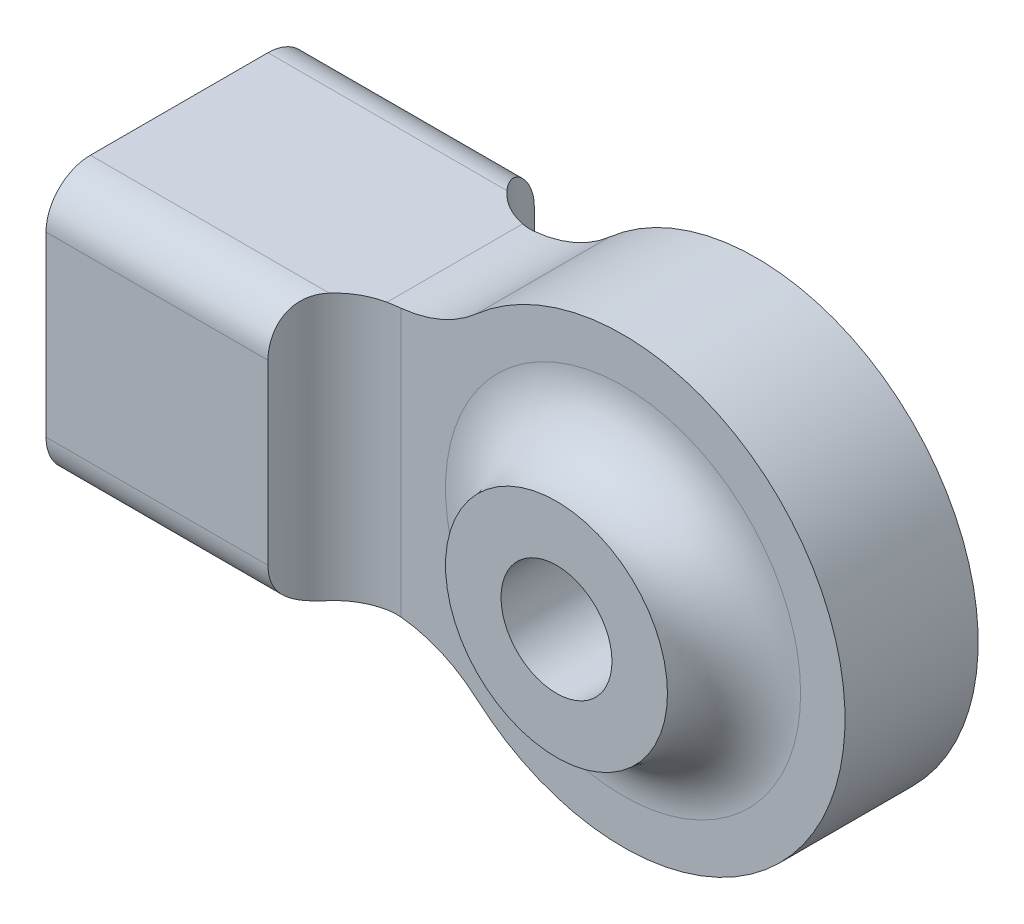
ISO-10303-21;
HEADER;
FILE_DESCRIPTION(('STEP AP214'),'2;1');
FILE_NAME('part.step','',(''),(''),'','','');
FILE_SCHEMA(('AUTOMOTIVE_DESIGN { 1 0 10303 214 1 1 1 1 }'));
ENDSEC;
DATA;
#1=APPLICATION_CONTEXT('core data for automotive mechanical design processes');
#2=APPLICATION_PROTOCOL_DEFINITION('international standard','automotive_design',2000,#1);
#3=PRODUCT_CONTEXT('',#1,'mechanical');
#4=PRODUCT('Part','Part','',(#3));
#5=PRODUCT_RELATED_PRODUCT_CATEGORY('part','',(#4));
#6=PRODUCT_DEFINITION_FORMATION('','',#4);
#7=PRODUCT_DEFINITION_CONTEXT('part definition',#1,'design');
#8=PRODUCT_DEFINITION('design','',#6,#7);
#9=PRODUCT_DEFINITION_SHAPE('','',#8);
#10=(LENGTH_UNIT() NAMED_UNIT(*) SI_UNIT(.MILLI.,.METRE.));
#11=(NAMED_UNIT(*) PLANE_ANGLE_UNIT() SI_UNIT($,.RADIAN.));
#12=(NAMED_UNIT(*) SI_UNIT($,.STERADIAN.) SOLID_ANGLE_UNIT());
#13=UNCERTAINTY_MEASURE_WITH_UNIT(LENGTH_MEASURE(1.E-05),#10,'distance_accuracy_value','');
#14=(GEOMETRIC_REPRESENTATION_CONTEXT(3) GLOBAL_UNCERTAINTY_ASSIGNED_CONTEXT((#13)) GLOBAL_UNIT_ASSIGNED_CONTEXT((#10,
#11,#12)) REPRESENTATION_CONTEXT('',''));
#15=CARTESIAN_POINT('',(0.,0.,0.));
#16=DIRECTION('',(0.,0.,1.));
#17=DIRECTION('',(1.,0.,0.));
#18=AXIS2_PLACEMENT_3D('',#15,#16,#17);
#19=CARTESIAN_POINT('',(0.,0.,0.));
#20=DIRECTION('',(0.,0.,1.));
#21=DIRECTION('',(1.,0.,0.));
#22=AXIS2_PLACEMENT_3D('',#19,#20,#21);
#23=PLANE('',#22);
#24=CARTESIAN_POINT('',(0.,0.,0.));
#25=DIRECTION('',(0.,0.,1.));
#26=DIRECTION('',(1.,0.,0.));
#27=AXIS2_PLACEMENT_3D('',#24,#25,#26);
#28=CIRCLE('',#27,8.);
#29=CARTESIAN_POINT('',(8.,0.,0.));
#30=VERTEX_POINT('',#29);
#31=EDGE_CURVE('E43',#30,#30,#28,.T.);
#32=ORIENTED_EDGE('',*,*,#31,.T.);
#33=EDGE_LOOP('',(#32));
#34=FACE_BOUND('',#33,.T.);
#35=CARTESIAN_POINT('',(0.,0.,0.));
#36=DIRECTION('',(0.,0.,1.));
#37=DIRECTION('',(1.,0.,0.));
#38=AXIS2_PLACEMENT_3D('',#35,#36,#37);
#39=CIRCLE('',#38,10.);
#40=CARTESIAN_POINT('',(-6.61437827766148,-7.5,0.));
#41=VERTEX_POINT('',#40);
#42=CARTESIAN_POINT('',(-6.61437827766148,7.5,0.));
#43=VERTEX_POINT('',#42);
#44=EDGE_CURVE('E503',#41,#43,#39,.T.);
#45=ORIENTED_EDGE('',*,*,#44,.F.);
#46=CARTESIAN_POINT('',(-10.5830052442584,-12.,0.));
#47=DIRECTION('',(0.,0.,1.));
#48=DIRECTION('',(1.,0.,0.));
#49=AXIS2_PLACEMENT_3D('',#46,#47,#48);
#50=CIRCLE('',#49,6.);
#51=CARTESIAN_POINT('',(-10.,-6.02839176727347,0.));
#52=VERTEX_POINT('',#51);
#53=EDGE_CURVE('E197',#41,#52,#50,.T.);
#54=ORIENTED_EDGE('',*,*,#53,.T.);
#55=DIRECTION('',(0.,-1.,0.));
#56=VECTOR('',#55,1.);
#57=CARTESIAN_POINT('',(-10.,6.,0.));
#58=LINE('',#57,#56);
#59=CARTESIAN_POINT('',(-10.,6.02839176727347,0.));
#60=VERTEX_POINT('',#59);
#61=EDGE_CURVE('E518',#52,#60,#58,.F.);
#62=ORIENTED_EDGE('',*,*,#61,.T.);
#63=CARTESIAN_POINT('',(-10.5830052442584,12.,0.));
#64=DIRECTION('',(0.,0.,1.));
#65=DIRECTION('',(1.,0.,0.));
#66=AXIS2_PLACEMENT_3D('',#63,#64,#65);
#67=CIRCLE('',#66,6.);
#68=EDGE_CURVE('E146',#60,#43,#67,.T.);
#69=ORIENTED_EDGE('',*,*,#68,.T.);
#70=EDGE_LOOP('',(#45,#54,#62,#69));
#71=FACE_BOUND('',#70,.T.);
#72=ADVANCED_FACE('F35',(#34,#71),#23,.F.);
#73=CARTESIAN_POINT('',(0.,0.,6.));
#74=DIRECTION('',(0.,0.,-1.));
#75=DIRECTION('',(-1.,0.,0.));
#76=AXIS2_PLACEMENT_3D('',#73,#74,#75);
#77=CYLINDRICAL_SURFACE('',#76,10.);
#78=ORIENTED_EDGE('',*,*,#44,.T.);
#79=DIRECTION('',(0.,0.,-1.));
#80=VECTOR('',#79,1.);
#81=CARTESIAN_POINT('',(-6.61437827766148,7.5,6.));
#82=LINE('',#81,#80);
#83=CARTESIAN_POINT('',(-6.61437827766148,7.5,6.));
#84=VERTEX_POINT('',#83);
#85=EDGE_CURVE('E173',#43,#84,#82,.F.);
#86=ORIENTED_EDGE('',*,*,#85,.T.);
#87=CARTESIAN_POINT('',(0.,0.,6.));
#88=DIRECTION('',(0.,0.,1.));
#89=DIRECTION('',(1.,0.,0.));
#90=AXIS2_PLACEMENT_3D('',#87,#88,#89);
#91=CIRCLE('',#90,10.);
#92=CARTESIAN_POINT('',(-6.61437827766148,-7.5,6.));
#93=VERTEX_POINT('',#92);
#94=EDGE_CURVE('E506',#93,#84,#91,.T.);
#95=ORIENTED_EDGE('',*,*,#94,.F.);
#96=DIRECTION('',(0.,0.,-1.));
#97=VECTOR('',#96,1.);
#98=CARTESIAN_POINT('',(-6.61437827766148,-7.5,6.));
#99=LINE('',#98,#97);
#100=EDGE_CURVE('E160',#93,#41,#99,.T.);
#101=ORIENTED_EDGE('',*,*,#100,.T.);
#102=EDGE_LOOP('',(#78,#86,#95,#101));
#103=FACE_BOUND('',#102,.T.);
#104=ADVANCED_FACE('F206',(#103),#77,.T.);
#105=CARTESIAN_POINT('',(0.,6.,6.));
#106=DIRECTION('',(0.,-1.,0.));
#107=DIRECTION('',(1.,0.,0.));
#108=AXIS2_PLACEMENT_3D('',#105,#106,#107);
#109=PLANE('',#108);
#110=DIRECTION('',(0.,0.,-1.));
#111=VECTOR('',#110,1.);
#112=CARTESIAN_POINT('',(-23.,6.,6.));
#113=LINE('',#112,#111);
#114=CARTESIAN_POINT('',(-23.,6.,7.00000000000001));
#115=VERTEX_POINT('',#114);
#116=CARTESIAN_POINT('',(-23.,6.,-0.999999999999999));
#117=VERTEX_POINT('',#116);
#118=EDGE_CURVE('E513',#115,#117,#113,.T.);
#119=ORIENTED_EDGE('',*,*,#118,.F.);
#120=DIRECTION('',(-1.,0.,0.));
#121=VECTOR('',#120,1.);
#122=CARTESIAN_POINT('',(0.,6.,7.00000000000001));
#123=LINE('',#122,#121);
#124=CARTESIAN_POINT('',(-12.2360679774998,6.,7.00000000000001));
#125=VERTEX_POINT('',#124);
#126=EDGE_CURVE('E226',#115,#125,#123,.F.);
#127=ORIENTED_EDGE('',*,*,#126,.T.);
#128=CARTESIAN_POINT('',(-10.,6.,9.));
#129=DIRECTION('',(0.,-1.,0.));
#130=DIRECTION('',(1.,0.,0.));
#131=AXIS2_PLACEMENT_3D('',#128,#129,#130);
#132=CIRCLE('',#131,3.);
#133=CARTESIAN_POINT('',(-10.5830052442584,6.,6.05719438542617));
#134=VERTEX_POINT('',#133);
#135=EDGE_CURVE('E158',#125,#134,#132,.T.);
#136=ORIENTED_EDGE('',*,*,#135,.T.);
#137=DIRECTION('',(0.,0.,1.));
#138=VECTOR('',#137,1.);
#139=CARTESIAN_POINT('',(-10.5830052442584,6.,0.));
#140=LINE('',#139,#138);
#141=CARTESIAN_POINT('',(-10.5830052442584,6.,-0.0571943854261723));
#142=VERTEX_POINT('',#141);
#143=EDGE_CURVE('E144',#134,#142,#140,.F.);
#144=ORIENTED_EDGE('',*,*,#143,.T.);
#145=CARTESIAN_POINT('',(-10.,6.,-3.));
#146=DIRECTION('',(0.,-1.,0.));
#147=DIRECTION('',(1.,0.,0.));
#148=AXIS2_PLACEMENT_3D('',#145,#146,#147);
#149=CIRCLE('',#148,3.);
#150=CARTESIAN_POINT('',(-12.2360679774998,6.,-1.));
#151=VERTEX_POINT('',#150);
#152=EDGE_CURVE('E155',#142,#151,#149,.T.);
#153=ORIENTED_EDGE('',*,*,#152,.T.);
#154=DIRECTION('',(-1.,0.,0.));
#155=VECTOR('',#154,1.);
#156=CARTESIAN_POINT('',(-23.,6.,-0.999999999999999));
#157=LINE('',#156,#155);
#158=EDGE_CURVE('E568',#151,#117,#157,.T.);
#159=ORIENTED_EDGE('',*,*,#158,.T.);
#160=EDGE_LOOP('',(#119,#127,#136,#144,#153,#159));
#161=FACE_BOUND('',#160,.T.);
#162=ADVANCED_FACE('F153',(#161),#109,.F.);
#163=CARTESIAN_POINT('',(-23.,0.,6.));
#164=DIRECTION('',(-1.,0.,0.));
#165=DIRECTION('',(0.,0.,1.));
#166=AXIS2_PLACEMENT_3D('',#163,#164,#165);
#167=PLANE('',#166);
#168=CARTESIAN_POINT('',(-23.,0.,3.));
#169=DIRECTION('',(-1.,0.,0.));
#170=DIRECTION('',(0.,0.,1.));
#171=AXIS2_PLACEMENT_3D('',#168,#169,#170);
#172=CIRCLE('',#171,2.5);
#173=CARTESIAN_POINT('',(-23.,0.,5.5));
#174=VERTEX_POINT('',#173);
#175=EDGE_CURVE('E483',#174,#174,#172,.T.);
#176=ORIENTED_EDGE('',*,*,#175,.F.);
#177=EDGE_LOOP('',(#176));
#178=FACE_BOUND('',#177,.T.);
#179=DIRECTION('',(0.,-1.,0.));
#180=VECTOR('',#179,1.);
#181=CARTESIAN_POINT('',(-23.,0.,9.00000000000001));
#182=LINE('',#181,#180);
#183=CARTESIAN_POINT('',(-23.,4.,9.00000000000001));
#184=VERTEX_POINT('',#183);
#185=CARTESIAN_POINT('',(-23.,-4.,9.00000000000001));
#186=VERTEX_POINT('',#185);
#187=EDGE_CURVE('E497',#184,#186,#182,.T.);
#188=ORIENTED_EDGE('',*,*,#187,.F.);
#189=CARTESIAN_POINT('',(-23.,4.,7.00000000000001));
#190=DIRECTION('',(-1.,0.,0.));
#191=DIRECTION('',(0.,0.,1.));
#192=AXIS2_PLACEMENT_3D('',#189,#190,#191);
#193=CIRCLE('',#192,2.);
#194=EDGE_CURVE('E558',#184,#115,#193,.T.);
#195=ORIENTED_EDGE('',*,*,#194,.T.);
#196=ORIENTED_EDGE('',*,*,#118,.T.);
#197=CARTESIAN_POINT('',(-23.,4.,-0.999999999999999));
#198=DIRECTION('',(-1.,0.,0.));
#199=DIRECTION('',(0.,0.,1.));
#200=AXIS2_PLACEMENT_3D('',#197,#198,#199);
#201=CIRCLE('',#200,2.);
#202=CARTESIAN_POINT('',(-23.,4.,-3.));
#203=VERTEX_POINT('',#202);
#204=EDGE_CURVE('E566',#117,#203,#201,.T.);
#205=ORIENTED_EDGE('',*,*,#204,.T.);
#206=DIRECTION('',(0.,-1.,0.));
#207=VECTOR('',#206,1.);
#208=CARTESIAN_POINT('',(-23.,0.,-3.));
#209=LINE('',#208,#207);
#210=CARTESIAN_POINT('',(-23.,-4.,-3.));
#211=VERTEX_POINT('',#210);
#212=EDGE_CURVE('E492',#203,#211,#209,.T.);
#213=ORIENTED_EDGE('',*,*,#212,.T.);
#214=CARTESIAN_POINT('',(-23.,-4.,-0.999999999999998));
#215=DIRECTION('',(-1.,0.,0.));
#216=DIRECTION('',(0.,0.,1.));
#217=AXIS2_PLACEMENT_3D('',#214,#215,#216);
#218=CIRCLE('',#217,2.);
#219=CARTESIAN_POINT('',(-23.,-6.,-0.999999999999997));
#220=VERTEX_POINT('',#219);
#221=EDGE_CURVE('E560',#211,#220,#218,.T.);
#222=ORIENTED_EDGE('',*,*,#221,.T.);
#223=DIRECTION('',(0.,0.,-1.));
#224=VECTOR('',#223,1.);
#225=CARTESIAN_POINT('',(-23.,-6.,6.));
#226=LINE('',#225,#224);
#227=CARTESIAN_POINT('',(-23.,-6.,7.));
#228=VERTEX_POINT('',#227);
#229=EDGE_CURVE('E509',#228,#220,#226,.T.);
#230=ORIENTED_EDGE('',*,*,#229,.F.);
#231=CARTESIAN_POINT('',(-23.,-4.,7.));
#232=DIRECTION('',(-1.,0.,0.));
#233=DIRECTION('',(0.,0.,1.));
#234=AXIS2_PLACEMENT_3D('',#231,#232,#233);
#235=CIRCLE('',#234,2.);
#236=EDGE_CURVE('E531',#228,#186,#235,.T.);
#237=ORIENTED_EDGE('',*,*,#236,.T.);
#238=EDGE_LOOP('',(#188,#195,#196,#205,#213,#222,#230,#237));
#239=FACE_BOUND('',#238,.T.);
#240=ADVANCED_FACE('F271',(#178,#239),#167,.T.);
#241=CARTESIAN_POINT('',(0.,-6.,6.));
#242=DIRECTION('',(0.,-1.,0.));
#243=DIRECTION('',(0.,0.,-1.));
#244=AXIS2_PLACEMENT_3D('',#241,#242,#243);
#245=PLANE('',#244);
#246=ORIENTED_EDGE('',*,*,#229,.T.);
#247=DIRECTION('',(-1.,0.,0.));
#248=VECTOR('',#247,1.);
#249=CARTESIAN_POINT('',(0.,-6.,-0.999999999999997));
#250=LINE('',#249,#248);
#251=CARTESIAN_POINT('',(-12.2360679774998,-6.,-0.999999999999997));
#252=VERTEX_POINT('',#251);
#253=EDGE_CURVE('E50',#220,#252,#250,.F.);
#254=ORIENTED_EDGE('',*,*,#253,.T.);
#255=CARTESIAN_POINT('',(-10.,-6.,-3.));
#256=DIRECTION('',(0.,-1.,0.));
#257=DIRECTION('',(0.,0.,-1.));
#258=AXIS2_PLACEMENT_3D('',#255,#256,#257);
#259=CIRCLE('',#258,3.);
#260=CARTESIAN_POINT('',(-10.5830052442584,-6.,-0.057194385426171));
#261=VERTEX_POINT('',#260);
#262=EDGE_CURVE('E165',#252,#261,#259,.F.);
#263=ORIENTED_EDGE('',*,*,#262,.T.);
#264=DIRECTION('',(0.,0.,-1.));
#265=VECTOR('',#264,1.);
#266=CARTESIAN_POINT('',(-10.5830052442584,-6.,6.));
#267=LINE('',#266,#265);
#268=CARTESIAN_POINT('',(-10.5830052442584,-6.,6.05719438542617));
#269=VERTEX_POINT('',#268);
#270=EDGE_CURVE('E148',#261,#269,#267,.F.);
#271=ORIENTED_EDGE('',*,*,#270,.T.);
#272=CARTESIAN_POINT('',(-10.,-6.,9.));
#273=DIRECTION('',(0.,-1.,0.));
#274=DIRECTION('',(0.,0.,-1.));
#275=AXIS2_PLACEMENT_3D('',#272,#273,#274);
#276=CIRCLE('',#275,3.);
#277=CARTESIAN_POINT('',(-12.2360679774998,-6.,7.));
#278=VERTEX_POINT('',#277);
#279=EDGE_CURVE('E167',#269,#278,#276,.F.);
#280=ORIENTED_EDGE('',*,*,#279,.T.);
#281=DIRECTION('',(-1.,0.,0.));
#282=VECTOR('',#281,1.);
#283=CARTESIAN_POINT('',(-23.,-6.,7.));
#284=LINE('',#283,#282);
#285=EDGE_CURVE('E524',#278,#228,#284,.T.);
#286=ORIENTED_EDGE('',*,*,#285,.T.);
#287=EDGE_LOOP('',(#246,#254,#263,#271,#280,#286));
#288=FACE_BOUND('',#287,.T.);
#289=ADVANCED_FACE('F268',(#288),#245,.T.);
#290=CARTESIAN_POINT('',(0.,0.,6.));
#291=DIRECTION('',(0.,0.,1.));
#292=DIRECTION('',(1.,0.,0.));
#293=AXIS2_PLACEMENT_3D('',#290,#291,#292);
#294=PLANE('',#293);
#295=CARTESIAN_POINT('',(0.,0.,6.));
#296=DIRECTION('',(0.,0.,1.));
#297=DIRECTION('',(1.,0.,0.));
#298=AXIS2_PLACEMENT_3D('',#295,#296,#297);
#299=CIRCLE('',#298,8.);
#300=CARTESIAN_POINT('',(8.,0.,6.));
#301=VERTEX_POINT('',#300);
#302=EDGE_CURVE('E11',#301,#301,#299,.F.);
#303=ORIENTED_EDGE('',*,*,#302,.T.);
#304=EDGE_LOOP('',(#303));
#305=FACE_BOUND('',#304,.T.);
#306=ORIENTED_EDGE('',*,*,#94,.T.);
#307=CARTESIAN_POINT('',(-10.5830052442584,12.,6.));
#308=DIRECTION('',(0.,0.,1.));
#309=DIRECTION('',(1.,0.,0.));
#310=AXIS2_PLACEMENT_3D('',#307,#308,#309);
#311=CIRCLE('',#310,6.);
#312=CARTESIAN_POINT('',(-10.,6.02839176727347,6.));
#313=VERTEX_POINT('',#312);
#314=EDGE_CURVE('E198',#84,#313,#311,.F.);
#315=ORIENTED_EDGE('',*,*,#314,.T.);
#316=DIRECTION('',(0.,1.,0.));
#317=VECTOR('',#316,1.);
#318=CARTESIAN_POINT('',(-10.,0.,6.));
#319=LINE('',#318,#317);
#320=CARTESIAN_POINT('',(-10.,-6.02839176727347,6.));
#321=VERTEX_POINT('',#320);
#322=EDGE_CURVE('E516',#313,#321,#319,.F.);
#323=ORIENTED_EDGE('',*,*,#322,.T.);
#324=CARTESIAN_POINT('',(-10.5830052442584,-12.,6.));
#325=DIRECTION('',(0.,0.,1.));
#326=DIRECTION('',(1.,0.,0.));
#327=AXIS2_PLACEMENT_3D('',#324,#325,#326);
#328=CIRCLE('',#327,6.);
#329=EDGE_CURVE('E562',#321,#93,#328,.F.);
#330=ORIENTED_EDGE('',*,*,#329,.T.);
#331=EDGE_LOOP('',(#306,#315,#323,#330));
#332=FACE_BOUND('',#331,.T.);
#333=ADVANCED_FACE('F266',(#305,#332),#294,.T.);
#334=CARTESIAN_POINT('',(-13.,0.,9.00000000000001));
#335=DIRECTION('',(0.,0.,-1.));
#336=DIRECTION('',(0.,1.,0.));
#337=AXIS2_PLACEMENT_3D('',#334,#335,#336);
#338=PLANE('',#337);
#339=DIRECTION('',(0.,-1.,0.));
#340=VECTOR('',#339,1.);
#341=CARTESIAN_POINT('',(-13.,0.,9.00000000000001));
#342=LINE('',#341,#340);
#343=CARTESIAN_POINT('',(-13.,4.,9.00000000000001));
#344=VERTEX_POINT('',#343);
#345=CARTESIAN_POINT('',(-13.,-4.,9.00000000000001));
#346=VERTEX_POINT('',#345);
#347=EDGE_CURVE('E500',#344,#346,#342,.T.);
#348=ORIENTED_EDGE('',*,*,#347,.F.);
#349=DIRECTION('',(-1.,0.,0.));
#350=VECTOR('',#349,1.);
#351=CARTESIAN_POINT('',(-13.,4.,9.00000000000001));
#352=LINE('',#351,#350);
#353=EDGE_CURVE('E555',#344,#184,#352,.T.);
#354=ORIENTED_EDGE('',*,*,#353,.T.);
#355=ORIENTED_EDGE('',*,*,#187,.T.);
#356=DIRECTION('',(-1.,0.,0.));
#357=VECTOR('',#356,1.);
#358=CARTESIAN_POINT('',(-13.,-4.,9.00000000000001));
#359=LINE('',#358,#357);
#360=EDGE_CURVE('E557',#186,#346,#359,.F.);
#361=ORIENTED_EDGE('',*,*,#360,.T.);
#362=EDGE_LOOP('',(#348,#354,#355,#361));
#363=FACE_BOUND('',#362,.T.);
#364=ADVANCED_FACE('F295',(#363),#338,.F.);
#365=CARTESIAN_POINT('',(-13.,0.,-3.));
#366=DIRECTION('',(0.,0.,-1.));
#367=DIRECTION('',(0.,1.,0.));
#368=AXIS2_PLACEMENT_3D('',#365,#366,#367);
#369=PLANE('',#368);
#370=ORIENTED_EDGE('',*,*,#212,.F.);
#371=DIRECTION('',(-1.,0.,0.));
#372=VECTOR('',#371,1.);
#373=CARTESIAN_POINT('',(-13.,4.,-3.));
#374=LINE('',#373,#372);
#375=CARTESIAN_POINT('',(-13.,4.,-3.));
#376=VERTEX_POINT('',#375);
#377=EDGE_CURVE('E545',#203,#376,#374,.F.);
#378=ORIENTED_EDGE('',*,*,#377,.T.);
#379=DIRECTION('',(0.,-1.,0.));
#380=VECTOR('',#379,1.);
#381=CARTESIAN_POINT('',(-13.,0.,-3.));
#382=LINE('',#381,#380);
#383=CARTESIAN_POINT('',(-13.,-4.,-3.));
#384=VERTEX_POINT('',#383);
#385=EDGE_CURVE('E495',#376,#384,#382,.T.);
#386=ORIENTED_EDGE('',*,*,#385,.T.);
#387=DIRECTION('',(-1.,0.,0.));
#388=VECTOR('',#387,1.);
#389=CARTESIAN_POINT('',(-13.,-4.,-3.));
#390=LINE('',#389,#388);
#391=EDGE_CURVE('E546',#384,#211,#390,.T.);
#392=ORIENTED_EDGE('',*,*,#391,.T.);
#393=EDGE_LOOP('',(#370,#378,#386,#392));
#394=FACE_BOUND('',#393,.T.);
#395=ADVANCED_FACE('F204',(#394),#369,.T.);
#396=CARTESIAN_POINT('',(-10.,0.,9.));
#397=DIRECTION('',(0.,1.,0.));
#398=DIRECTION('',(0.,0.,1.));
#399=AXIS2_PLACEMENT_3D('',#396,#397,#398);
#400=CYLINDRICAL_SURFACE('',#399,3.);
#401=ORIENTED_EDGE('',*,*,#135,.F.);
#402=CARTESIAN_POINT('',(-12.2360679774998,6.,7.00000000000001));
#403=CARTESIAN_POINT('',(-12.2728854963177,6.00000246436278,7.04115091780122));
#404=CARTESIAN_POINT('',(-12.3085660720211,5.99872941245928,7.08334205467759));
#405=CARTESIAN_POINT('',(-12.3774925726874,5.99326859290413,7.16954514222249));
#406=CARTESIAN_POINT('',(-12.4107363184585,5.98907825071382,7.21355866887521));
#407=CARTESIAN_POINT('',(-12.4746704788407,5.97739818389775,7.30322436177444));
#408=CARTESIAN_POINT('',(-12.5053518867135,5.96989735912992,7.34888156219626));
#409=CARTESIAN_POINT('',(-12.5638442589029,5.95128752456252,7.44125077197121));
#410=CARTESIAN_POINT('',(-12.5916560751113,5.94017958968548,7.48796246323106));
#411=CARTESIAN_POINT('',(-12.670883895736,5.90084828303763,7.62957808407147));
#412=CARTESIAN_POINT('',(-12.7177688524955,5.86666959692464,7.72550494882894));
#413=CARTESIAN_POINT('',(-12.7987755505931,5.78149511078044,7.91488962633863));
#414=CARTESIAN_POINT('',(-12.8329313455432,5.73054487740597,8.0083533960413));
#415=CARTESIAN_POINT('',(-12.8869362313674,5.61797275843954,8.17968923532625));
#416=CARTESIAN_POINT('',(-12.9078328939747,5.55781591522778,8.25819990460024));
#417=CARTESIAN_POINT('',(-12.9416683233782,5.42546942572144,8.40638422576809));
#418=CARTESIAN_POINT('',(-12.9545996137314,5.35326855519881,8.47604952670763));
#419=CARTESIAN_POINT('',(-12.974558972197,5.19804023541891,8.60466864816259));
#420=CARTESIAN_POINT('',(-12.9815304946049,5.11491753034152,8.66351579566274));
#421=CARTESIAN_POINT('',(-12.9914768287617,4.94050336835899,8.76799188089132));
#422=CARTESIAN_POINT('',(-12.9944498592886,4.84920829018026,8.81361492053613));
#423=CARTESIAN_POINT('',(-12.9983820643305,4.65405126321282,8.89317117612618));
#424=CARTESIAN_POINT('',(-12.999184112796,4.54975715834621,8.92605072649268));
#425=CARTESIAN_POINT('',(-12.9999891159124,4.33731369422501,8.9743473813685));
#426=CARTESIAN_POINT('',(-12.9999934707567,4.229171423518,8.98979503673855));
#427=CARTESIAN_POINT('',(-12.9999985880697,4.10055601943193,8.99757270719581));
#428=CARTESIAN_POINT('',(-12.9999993865401,4.08044281491849,8.99848335718228));
#429=CARTESIAN_POINT('',(-13.0000003370699,4.04022157349941,8.99969624226284));
#430=CARTESIAN_POINT('',(-13.0000004898832,4.02011355800554,8.99999918686816));
#431=CARTESIAN_POINT('',(-13.,4.,9.00000000000001));
#432=B_SPLINE_CURVE_WITH_KNOTS('',3,(#402,#403,#404,#405,#406,#407,#408,#409,#410,#411,#412,
#413,#414,#415,#416,#417,#418,#419,#420,#421,#422,#423,#424,#425,#426,#427,#428,#429,#430,#431),
.UNSPECIFIED.,.F.,.F.,(4,2,2,2,2,2,2,2,2,2,2,2,2,2,4),(0.,0.16564009897896,0.331426562654032,
0.497773186994362,0.664070285290275,0.998329719602763,1.33168839760093,1.63351885718953,
1.93563219034523,2.2405811028478,2.54566581704908,2.87230570272864,3.19837223112797,
3.25877009040263,3.31909739252996),.UNSPECIFIED.);
#433=EDGE_CURVE('E225',#125,#344,#432,.T.);
#434=ORIENTED_EDGE('',*,*,#433,.T.);
#435=ORIENTED_EDGE('',*,*,#347,.T.);
#436=CARTESIAN_POINT('',(-13.,-4.,9.00000000000001));
#437=CARTESIAN_POINT('',(-12.9999884326362,-4.05599686132418,9.000005262699));
#438=CARTESIAN_POINT('',(-12.9999997013507,-4.1119911449692,8.99764827062337));
#439=CARTESIAN_POINT('',(-12.9999837288537,-4.22358374028054,8.98825056109522));
#440=CARTESIAN_POINT('',(-12.9999564887583,-4.27918206337689,8.98120997940049));
#441=CARTESIAN_POINT('',(-12.9997792949131,-4.38961436706547,8.96248262206721));
#442=CARTESIAN_POINT('',(-12.9996292985889,-4.44444807576247,8.95079423519837));
#443=CARTESIAN_POINT('',(-12.9990404148046,-4.5529256613112,8.922866259538));
#444=CARTESIAN_POINT('',(-12.9986015309304,-4.60656955292362,8.90662672724145));
#445=CARTESIAN_POINT('',(-12.9965397925711,-4.76522710422997,8.85120301996766));
#446=CARTESIAN_POINT('',(-12.9941719425829,-4.86798328940342,8.80531089645993));
#447=CARTESIAN_POINT('',(-12.9851594624459,-5.06414644572652,8.69709894237695));
#448=CARTESIAN_POINT('',(-12.9785168322406,-5.15755776524344,8.6347868019053));
#449=CARTESIAN_POINT('',(-12.9583513085478,-5.33065671648364,8.49711250770347));
#450=CARTESIAN_POINT('',(-12.9449556045598,-5.41056284194727,8.42200800641799));
#451=CARTESIAN_POINT('',(-12.908733582955,-5.55611420750753,8.26105503961363));
#452=CARTESIAN_POINT('',(-12.885914002479,-5.62176958443007,8.17521427996012));
#453=CARTESIAN_POINT('',(-12.8308325608467,-5.73313312311182,8.0030142875193));
#454=CARTESIAN_POINT('',(-12.7993289855582,-5.77990343395688,7.91709767691641));
#455=CARTESIAN_POINT('',(-12.7257118447269,-5.85921881265892,7.74326050418015));
#456=CARTESIAN_POINT('',(-12.6835961403598,-5.89176100928625,7.65533954133192));
#457=CARTESIAN_POINT('',(-12.5900459204144,-5.94282215801971,7.48306942902296));
#458=CARTESIAN_POINT('',(-12.5388300936748,-5.96162628065119,7.39868410667865));
#459=CARTESIAN_POINT('',(-12.4274116934532,-5.98796416149656,7.23435249410234));
#460=CARTESIAN_POINT('',(-12.3672165930771,-5.99550723492245,7.15440258764249));
#461=CARTESIAN_POINT('',(-12.2812299672423,-5.99951424555895,7.05136489608614));
#462=CARTESIAN_POINT('',(-12.2588631749984,-6.00000237448964,7.02547723845672));
#463=CARTESIAN_POINT('',(-12.2360679774998,-6.,7.));
#464=B_SPLINE_CURVE_WITH_KNOTS('',3,(#436,#437,#438,#439,#440,#441,#442,#443,#444,#445,#446,
#447,#448,#449,#450,#451,#452,#453,#454,#455,#456,#457,#458,#459,#460,#461,#462,#463),
.UNSPECIFIED.,.F.,.F.,(4,2,2,2,2,2,2,2,2,2,2,2,2,4),(0.,0.167936324313904,0.33586778106424,
0.503857504557729,0.671845142827373,1.00777038849101,1.34353858664391,1.67320672252813,
2.00263958513158,2.30939066341829,2.61620361545126,2.9164513504635,3.21645058074121,
3.31905049107515),.UNSPECIFIED.);
#465=EDGE_CURVE('E219',#346,#278,#464,.T.);
#466=ORIENTED_EDGE('',*,*,#465,.T.);
#467=ORIENTED_EDGE('',*,*,#279,.F.);
#468=CARTESIAN_POINT('',(-10.5830052442584,-6.,6.05719438542617));
#469=CARTESIAN_POINT('',(-10.5348963821223,-5.99999802537367,6.04766148317081));
#470=CARTESIAN_POINT('',(-10.4865527600391,-6.00057861731963,6.03931202697637));
#471=CARTESIAN_POINT('',(-10.3896868700852,-6.00292052178394,6.02501579972002));
#472=CARTESIAN_POINT('',(-10.3411655598158,-6.00467832094366,6.01906196335792));
#473=CARTESIAN_POINT('',(-10.2439475353533,-6.00938999985835,6.00953596795991));
#474=CARTESIAN_POINT('',(-10.1952508211571,-6.01234387963343,6.00596380896406));
#475=CARTESIAN_POINT('',(-10.0976830864442,-6.01945920765658,6.00119131034514));
#476=CARTESIAN_POINT('',(-10.0488119789526,-6.02362422834649,5.99999807070617));
#477=CARTESIAN_POINT('',(-10.,-6.02839176727347,6.));
#478=B_SPLINE_CURVE_WITH_KNOTS('',3,(#468,#469,#470,#471,#472,#473,#474,#475,#476,#477),
.UNSPECIFIED.,.F.,.F.,(4,2,2,2,4),(0.,0.1471149142572,0.293792711217423,0.440470510645301,
0.587585424636055),.UNSPECIFIED.);
#479=EDGE_CURVE('E213',#269,#321,#478,.T.);
#480=ORIENTED_EDGE('',*,*,#479,.T.);
#481=ORIENTED_EDGE('',*,*,#322,.F.);
#482=CARTESIAN_POINT('',(-10.,6.02839176727347,6.));
#483=CARTESIAN_POINT('',(-10.0488119789526,6.02362422834649,5.99999807070617));
#484=CARTESIAN_POINT('',(-10.0976830864443,6.01945920765658,6.00119131034514));
#485=CARTESIAN_POINT('',(-10.1952508211571,6.01234387963343,6.00596380896406));
#486=CARTESIAN_POINT('',(-10.2439475353533,6.00938999985835,6.00953596795991));
#487=CARTESIAN_POINT('',(-10.3411655598158,6.00467832094366,6.01906196335792));
#488=CARTESIAN_POINT('',(-10.3896868700852,6.00292052178394,6.02501579972002));
#489=CARTESIAN_POINT('',(-10.4865527600391,6.00057861731963,6.03931202697637));
#490=CARTESIAN_POINT('',(-10.5348963821223,5.99999802537367,6.04766148317081));
#491=CARTESIAN_POINT('',(-10.5830052442584,6.,6.05719438542617));
#492=B_SPLINE_CURVE_WITH_KNOTS('',3,(#482,#483,#484,#485,#486,#487,#488,#489,#490,#491),
.UNSPECIFIED.,.F.,.F.,(4,2,2,2,4),(0.,0.147114913990756,0.293792713418633,0.440470510378855,
0.587585424636057),.UNSPECIFIED.);
#493=EDGE_CURVE('E192',#313,#134,#492,.T.);
#494=ORIENTED_EDGE('',*,*,#493,.T.);
#495=EDGE_LOOP('',(#401,#434,#435,#466,#467,#480,#481,#494));
#496=FACE_BOUND('',#495,.T.);
#497=ADVANCED_FACE('F200',(#496),#400,.F.);
#498=CARTESIAN_POINT('',(-10.,0.,-3.));
#499=DIRECTION('',(0.,1.,0.));
#500=DIRECTION('',(0.,0.,1.));
#501=AXIS2_PLACEMENT_3D('',#498,#499,#500);
#502=CYLINDRICAL_SURFACE('',#501,3.);
#503=ORIENTED_EDGE('',*,*,#385,.F.);
#504=CARTESIAN_POINT('',(-13.,4.,-3.));
#505=CARTESIAN_POINT('',(-12.9999884326362,4.05599686132418,-3.00000526269899));
#506=CARTESIAN_POINT('',(-12.9999997013507,4.1119911449692,-2.99764827062337));
#507=CARTESIAN_POINT('',(-12.9999837288537,4.22358374028054,-2.98825056109522));
#508=CARTESIAN_POINT('',(-12.9999564887583,4.27918206337689,-2.98120997940048));
#509=CARTESIAN_POINT('',(-12.9997792949131,4.38961436706547,-2.96248262206721));
#510=CARTESIAN_POINT('',(-12.9996292985889,4.44444807576247,-2.95079423519837));
#511=CARTESIAN_POINT('',(-12.9990404148046,4.5529256613112,-2.92286625953799));
#512=CARTESIAN_POINT('',(-12.9986015309304,4.60656955292362,-2.90662672724145));
#513=CARTESIAN_POINT('',(-12.9965397925711,4.76522710422997,-2.85120301996766));
#514=CARTESIAN_POINT('',(-12.9941719425829,4.86798328940341,-2.80531089645993));
#515=CARTESIAN_POINT('',(-12.9851594624459,5.06414644572651,-2.69709894237695));
#516=CARTESIAN_POINT('',(-12.9785168322406,5.15755776524344,-2.6347868019053));
#517=CARTESIAN_POINT('',(-12.9583513085478,5.33065671648364,-2.49711250770347));
#518=CARTESIAN_POINT('',(-12.9449556045598,5.41056284194727,-2.42200800641799));
#519=CARTESIAN_POINT('',(-12.908733582955,5.55611420750752,-2.26105503961363));
#520=CARTESIAN_POINT('',(-12.885914002479,5.62176958443007,-2.17521427996012));
#521=CARTESIAN_POINT('',(-12.8308325608467,5.73313312311181,-2.0030142875193));
#522=CARTESIAN_POINT('',(-12.7993289855582,5.77990343395688,-1.91709767691641));
#523=CARTESIAN_POINT('',(-12.7257118447269,5.85921881265891,-1.74326050418015));
#524=CARTESIAN_POINT('',(-12.6835961403598,5.89176100928625,-1.65533954133192));
#525=CARTESIAN_POINT('',(-12.5900459204144,5.94282215801971,-1.48306942902296));
#526=CARTESIAN_POINT('',(-12.5388300936748,5.96162628065119,-1.39868410667865));
#527=CARTESIAN_POINT('',(-12.4274116934532,5.98796416149656,-1.23435249410234));
#528=CARTESIAN_POINT('',(-12.3672165930771,5.99550723492245,-1.15440258764248));
#529=CARTESIAN_POINT('',(-12.2812299672423,5.99951424555895,-1.05136489608613));
#530=CARTESIAN_POINT('',(-12.2588631749984,6.00000237448964,-1.02547723845671));
#531=CARTESIAN_POINT('',(-12.2360679774998,6.,-1.));
#532=B_SPLINE_CURVE_WITH_KNOTS('',3,(#504,#505,#506,#507,#508,#509,#510,#511,#512,#513,#514,
#515,#516,#517,#518,#519,#520,#521,#522,#523,#524,#525,#526,#527,#528,#529,#530,#531),
.UNSPECIFIED.,.F.,.F.,(4,2,2,2,2,2,2,2,2,2,2,2,2,4),(0.,0.167936324313904,0.33586778106424,
0.503857504557729,0.671845142827372,1.00777038849101,1.3435385866439,1.67320672252813,
2.00263958513158,2.30939066341828,2.61620361545126,2.9164513504635,3.21645058074121,
3.31905049107515),.UNSPECIFIED.);
#533=EDGE_CURVE('E164',#376,#151,#532,.T.);
#534=ORIENTED_EDGE('',*,*,#533,.T.);
#535=ORIENTED_EDGE('',*,*,#152,.F.);
#536=CARTESIAN_POINT('',(-10.5830052442584,6.,-0.0571943854261723));
#537=CARTESIAN_POINT('',(-10.5348963821223,5.99999802537367,-0.0476614831708093));
#538=CARTESIAN_POINT('',(-10.4865527600391,6.00057861731963,-0.0393120269763644));
#539=CARTESIAN_POINT('',(-10.3896868700852,6.00292052178394,-0.0250157997200161));
#540=CARTESIAN_POINT('',(-10.3411655598158,6.00467832094366,-0.0190619633579217));
#541=CARTESIAN_POINT('',(-10.2439475353533,6.00938999985835,-0.00953596795991056));
#542=CARTESIAN_POINT('',(-10.1952508211571,6.01234387963343,-0.0059638089640622));
#543=CARTESIAN_POINT('',(-10.0976830864442,6.01945920765658,-0.00119131034513847));
#544=CARTESIAN_POINT('',(-10.0488119789526,6.02362422834649,1.92929383279857E-06));
#545=CARTESIAN_POINT('',(-10.,6.02839176727347,0.));
#546=B_SPLINE_CURVE_WITH_KNOTS('',3,(#536,#537,#538,#539,#540,#541,#542,#543,#544,#545),
.UNSPECIFIED.,.F.,.F.,(4,2,2,2,4),(0.,0.147114914257202,0.293792711217425,0.440470510645302,
0.587585424636058),.UNSPECIFIED.);
#547=EDGE_CURVE('E139',#142,#60,#546,.T.);
#548=ORIENTED_EDGE('',*,*,#547,.T.);
#549=ORIENTED_EDGE('',*,*,#61,.F.);
#550=CARTESIAN_POINT('',(-10.,-6.02839176727347,0.));
#551=CARTESIAN_POINT('',(-10.0488119789526,-6.02362422834649,1.92929383262574E-06));
#552=CARTESIAN_POINT('',(-10.0976830864442,-6.01945920765658,-0.00119131034513852));
#553=CARTESIAN_POINT('',(-10.1952508211571,-6.01234387963343,-0.00596380896406199));
#554=CARTESIAN_POINT('',(-10.2439475353533,-6.00938999985835,-0.00953596795991023));
#555=CARTESIAN_POINT('',(-10.3411655598158,-6.00467832094366,-0.0190619633579214));
#556=CARTESIAN_POINT('',(-10.3896868700852,-6.00292052178394,-0.0250157997200159));
#557=CARTESIAN_POINT('',(-10.4865527600391,-6.00057861731963,-0.0393120269763642));
#558=CARTESIAN_POINT('',(-10.5348963821223,-5.99999802537367,-0.047661483170809));
#559=CARTESIAN_POINT('',(-10.5830052442584,-6.,-0.0571943854261715));
#560=B_SPLINE_CURVE_WITH_KNOTS('',3,(#550,#551,#552,#553,#554,#555,#556,#557,#558,#559),
.UNSPECIFIED.,.F.,.F.,(4,2,2,2,4),(0.,0.147114913990754,0.293792713418632,0.440470510378854,
0.587585424636055),.UNSPECIFIED.);
#561=EDGE_CURVE('E574',#52,#261,#560,.T.);
#562=ORIENTED_EDGE('',*,*,#561,.T.);
#563=ORIENTED_EDGE('',*,*,#262,.F.);
#564=CARTESIAN_POINT('',(-12.2360679774998,-6.,-0.999999999999998));
#565=CARTESIAN_POINT('',(-12.2728854963177,-6.00000246436278,-1.04115091780121));
#566=CARTESIAN_POINT('',(-12.3085660720211,-5.99872941245929,-1.08334205467758));
#567=CARTESIAN_POINT('',(-12.3774925726874,-5.99326859290413,-1.16954514222248));
#568=CARTESIAN_POINT('',(-12.4107363184585,-5.98907825071382,-1.21355866887521));
#569=CARTESIAN_POINT('',(-12.4746704788407,-5.97739818389775,-1.30322436177444));
#570=CARTESIAN_POINT('',(-12.5053518867135,-5.96989735912992,-1.34888156219626));
#571=CARTESIAN_POINT('',(-12.5638442589029,-5.95128752456252,-1.44125077197121));
#572=CARTESIAN_POINT('',(-12.5916560751113,-5.94017958968548,-1.48796246323106));
#573=CARTESIAN_POINT('',(-12.670883895736,-5.90084828303763,-1.62957808407147));
#574=CARTESIAN_POINT('',(-12.7177688524955,-5.86666959692464,-1.72550494882893));
#575=CARTESIAN_POINT('',(-12.7987755505931,-5.78149511078044,-1.91488962633863));
#576=CARTESIAN_POINT('',(-12.8329313455432,-5.73054487740597,-2.00835339604129));
#577=CARTESIAN_POINT('',(-12.8869362313674,-5.61797275843955,-2.17968923532625));
#578=CARTESIAN_POINT('',(-12.9078328939747,-5.55781591522778,-2.25819990460023));
#579=CARTESIAN_POINT('',(-12.9416683233782,-5.42546942572144,-2.40638422576808));
#580=CARTESIAN_POINT('',(-12.9545996137314,-5.35326855519881,-2.47604952670762));
#581=CARTESIAN_POINT('',(-12.974558972197,-5.19804023541891,-2.60466864816258));
#582=CARTESIAN_POINT('',(-12.9815304946049,-5.11491753034152,-2.66351579566273));
#583=CARTESIAN_POINT('',(-12.9914768287617,-4.94050336835899,-2.76799188089131));
#584=CARTESIAN_POINT('',(-12.9944498592886,-4.84920829018026,-2.81361492053613));
#585=CARTESIAN_POINT('',(-12.9983820643305,-4.65405126321282,-2.89317117612617));
#586=CARTESIAN_POINT('',(-12.999184112796,-4.54975715834621,-2.92605072649268));
#587=CARTESIAN_POINT('',(-12.9999891159124,-4.33731369422501,-2.97434738136849));
#588=CARTESIAN_POINT('',(-12.9999934707567,-4.229171423518,-2.98979503673854));
#589=CARTESIAN_POINT('',(-12.9999985880697,-4.10055601943193,-2.99757270719581));
#590=CARTESIAN_POINT('',(-12.9999993865401,-4.08044281491849,-2.99848335718227));
#591=CARTESIAN_POINT('',(-13.0000003370699,-4.04022157349941,-2.99969624226283));
#592=CARTESIAN_POINT('',(-13.0000004898832,-4.02011355800554,-2.99999918686816));
#593=CARTESIAN_POINT('',(-13.,-4.,-3.));
#594=B_SPLINE_CURVE_WITH_KNOTS('',3,(#564,#565,#566,#567,#568,#569,#570,#571,#572,#573,#574,
#575,#576,#577,#578,#579,#580,#581,#582,#583,#584,#585,#586,#587,#588,#589,#590,#591,#592,#593),
.UNSPECIFIED.,.F.,.F.,(4,2,2,2,2,2,2,2,2,2,2,2,2,2,4),(0.,0.165640098978961,0.331426562654033,
0.497773186994365,0.664070285290278,0.998329719602769,1.33168839760093,1.63351885718954,
1.93563219034523,2.24058110284781,2.54566581704908,2.87230570272865,3.19837223112797,
3.25877009040263,3.31909739252997),.UNSPECIFIED.);
#595=EDGE_CURVE('E57',#252,#384,#594,.T.);
#596=ORIENTED_EDGE('',*,*,#595,.T.);
#597=EDGE_LOOP('',(#503,#534,#535,#548,#549,#562,#563,#596));
#598=FACE_BOUND('',#597,.T.);
#599=ADVANCED_FACE('F162',(#598),#502,.F.);
#600=CARTESIAN_POINT('',(-10.5830052442584,12.,6.));
#601=DIRECTION('',(0.,0.,-1.));
#602=DIRECTION('',(-1.,0.,0.));
#603=AXIS2_PLACEMENT_3D('',#600,#601,#602);
#604=CYLINDRICAL_SURFACE('',#603,6.);
#605=ORIENTED_EDGE('',*,*,#314,.F.);
#606=ORIENTED_EDGE('',*,*,#85,.F.);
#607=ORIENTED_EDGE('',*,*,#68,.F.);
#608=ORIENTED_EDGE('',*,*,#547,.F.);
#609=ORIENTED_EDGE('',*,*,#143,.F.);
#610=ORIENTED_EDGE('',*,*,#493,.F.);
#611=EDGE_LOOP('',(#605,#606,#607,#608,#609,#610));
#612=FACE_BOUND('',#611,.T.);
#613=ADVANCED_FACE('F142',(#612),#604,.F.);
#614=CARTESIAN_POINT('',(-10.5830052442584,-12.,6.));
#615=DIRECTION('',(0.,0.,-1.));
#616=DIRECTION('',(-1.,0.,0.));
#617=AXIS2_PLACEMENT_3D('',#614,#615,#616);
#618=CYLINDRICAL_SURFACE('',#617,6.);
#619=ORIENTED_EDGE('',*,*,#479,.F.);
#620=ORIENTED_EDGE('',*,*,#270,.F.);
#621=ORIENTED_EDGE('',*,*,#561,.F.);
#622=ORIENTED_EDGE('',*,*,#53,.F.);
#623=ORIENTED_EDGE('',*,*,#100,.F.);
#624=ORIENTED_EDGE('',*,*,#329,.F.);
#625=EDGE_LOOP('',(#619,#620,#621,#622,#623,#624));
#626=FACE_BOUND('',#625,.T.);
#627=ADVANCED_FACE('F187',(#626),#618,.F.);
#628=CARTESIAN_POINT('',(-18.,0.,3.));
#629=DIRECTION('',(-1.,0.,0.));
#630=DIRECTION('',(0.,0.,1.));
#631=AXIS2_PLACEMENT_3D('',#628,#629,#630);
#632=CYLINDRICAL_SURFACE('',#631,2.5);
#633=CARTESIAN_POINT('',(-18.,0.,3.));
#634=DIRECTION('',(-1.,0.,0.));
#635=DIRECTION('',(0.,0.,1.));
#636=AXIS2_PLACEMENT_3D('',#633,#634,#635);
#637=CIRCLE('',#636,2.5);
#638=CARTESIAN_POINT('',(-18.,0.,5.5));
#639=VERTEX_POINT('',#638);
#640=EDGE_CURVE('E489',#639,#639,#637,.T.);
#641=ORIENTED_EDGE('',*,*,#640,.F.);
#642=EDGE_LOOP('',(#641));
#643=FACE_BOUND('',#642,.T.);
#644=ORIENTED_EDGE('',*,*,#175,.T.);
#645=EDGE_LOOP('',(#644));
#646=FACE_BOUND('',#645,.T.);
#647=ADVANCED_FACE('F328',(#643,#646),#632,.F.);
#648=CARTESIAN_POINT('',(-18.,0.,3.));
#649=DIRECTION('',(-1.,0.,0.));
#650=DIRECTION('',(0.,0.,1.));
#651=AXIS2_PLACEMENT_3D('',#648,#649,#650);
#652=PLANE('',#651);
#653=ORIENTED_EDGE('',*,*,#640,.T.);
#654=EDGE_LOOP('',(#653));
#655=FACE_BOUND('',#654,.T.);
#656=ADVANCED_FACE('F335',(#655),#652,.T.);
#657=CARTESIAN_POINT('',(-13.,4.,7.00000000000001));
#658=DIRECTION('',(-1.,0.,0.));
#659=DIRECTION('',(0.,-1.,0.));
#660=AXIS2_PLACEMENT_3D('',#657,#658,#659);
#661=CYLINDRICAL_SURFACE('',#660,2.);
#662=ORIENTED_EDGE('',*,*,#433,.F.);
#663=ORIENTED_EDGE('',*,*,#126,.F.);
#664=ORIENTED_EDGE('',*,*,#194,.F.);
#665=ORIENTED_EDGE('',*,*,#353,.F.);
#666=EDGE_LOOP('',(#662,#663,#664,#665));
#667=FACE_BOUND('',#666,.T.);
#668=ADVANCED_FACE('F342',(#667),#661,.T.);
#669=CARTESIAN_POINT('',(0.,4.,-0.999999999999999));
#670=DIRECTION('',(1.,0.,0.));
#671=DIRECTION('',(0.,1.,0.));
#672=AXIS2_PLACEMENT_3D('',#669,#670,#671);
#673=CYLINDRICAL_SURFACE('',#672,2.);
#674=ORIENTED_EDGE('',*,*,#533,.F.);
#675=ORIENTED_EDGE('',*,*,#377,.F.);
#676=ORIENTED_EDGE('',*,*,#204,.F.);
#677=ORIENTED_EDGE('',*,*,#158,.F.);
#678=EDGE_LOOP('',(#674,#675,#676,#677));
#679=FACE_BOUND('',#678,.T.);
#680=ADVANCED_FACE('F349',(#679),#673,.T.);
#681=CARTESIAN_POINT('',(-13.,-4.,-0.999999999999998));
#682=DIRECTION('',(-1.,0.,0.));
#683=DIRECTION('',(0.,0.,1.));
#684=AXIS2_PLACEMENT_3D('',#681,#682,#683);
#685=CYLINDRICAL_SURFACE('',#684,2.);
#686=ORIENTED_EDGE('',*,*,#595,.F.);
#687=ORIENTED_EDGE('',*,*,#253,.F.);
#688=ORIENTED_EDGE('',*,*,#221,.F.);
#689=ORIENTED_EDGE('',*,*,#391,.F.);
#690=EDGE_LOOP('',(#686,#687,#688,#689));
#691=FACE_BOUND('',#690,.T.);
#692=ADVANCED_FACE('F237',(#691),#685,.T.);
#693=CARTESIAN_POINT('',(0.,-4.,7.));
#694=DIRECTION('',(1.,0.,0.));
#695=DIRECTION('',(0.,0.,-1.));
#696=AXIS2_PLACEMENT_3D('',#693,#694,#695);
#697=CYLINDRICAL_SURFACE('',#696,2.);
#698=ORIENTED_EDGE('',*,*,#465,.F.);
#699=ORIENTED_EDGE('',*,*,#360,.F.);
#700=ORIENTED_EDGE('',*,*,#236,.F.);
#701=ORIENTED_EDGE('',*,*,#285,.F.);
#702=EDGE_LOOP('',(#698,#699,#700,#701));
#703=FACE_BOUND('',#702,.T.);
#704=ADVANCED_FACE('F232',(#703),#697,.T.);
#705=CARTESIAN_POINT('',(0.,0.,-3.));
#706=DIRECTION('',(0.,0.,-1.));
#707=DIRECTION('',(-1.,0.,0.));
#708=AXIS2_PLACEMENT_3D('',#705,#706,#707);
#709=PLANE('',#708);
#710=CARTESIAN_POINT('',(0.,0.,-3.));
#711=DIRECTION('',(0.,0.,-1.));
#712=DIRECTION('',(-1.,0.,0.));
#713=AXIS2_PLACEMENT_3D('',#710,#711,#712);
#714=CIRCLE('',#713,2.5);
#715=CARTESIAN_POINT('',(-2.5,0.,-3.));
#716=VERTEX_POINT('',#715);
#717=EDGE_CURVE('E485',#716,#716,#714,.T.);
#718=ORIENTED_EDGE('',*,*,#717,.F.);
#719=EDGE_LOOP('',(#718));
#720=FACE_BOUND('',#719,.T.);
#721=CARTESIAN_POINT('',(0.,0.,-3.));
#722=DIRECTION('',(0.,0.,-1.));
#723=DIRECTION('',(-1.,0.,0.));
#724=AXIS2_PLACEMENT_3D('',#721,#722,#723);
#725=CIRCLE('',#724,5.);
#726=CARTESIAN_POINT('',(-5.,0.,-3.));
#727=VERTEX_POINT('',#726);
#728=EDGE_CURVE('E480',#727,#727,#725,.T.);
#729=ORIENTED_EDGE('',*,*,#728,.T.);
#730=EDGE_LOOP('',(#729));
#731=FACE_BOUND('',#730,.T.);
#732=ADVANCED_FACE('F236',(#720,#731),#709,.T.);
#733=CARTESIAN_POINT('',(0.,0.,9.));
#734=DIRECTION('',(0.,0.,1.));
#735=DIRECTION('',(1.,0.,0.));
#736=AXIS2_PLACEMENT_3D('',#733,#734,#735);
#737=PLANE('',#736);
#738=CARTESIAN_POINT('',(0.,0.,9.));
#739=DIRECTION('',(0.,0.,1.));
#740=DIRECTION('',(1.,0.,0.));
#741=AXIS2_PLACEMENT_3D('',#738,#739,#740);
#742=CIRCLE('',#741,2.5);
#743=CARTESIAN_POINT('',(2.5,0.,9.));
#744=VERTEX_POINT('',#743);
#745=EDGE_CURVE('E475',#744,#744,#742,.T.);
#746=ORIENTED_EDGE('',*,*,#745,.F.);
#747=EDGE_LOOP('',(#746));
#748=FACE_BOUND('',#747,.T.);
#749=CARTESIAN_POINT('',(0.,0.,9.));
#750=DIRECTION('',(0.,0.,1.));
#751=DIRECTION('',(1.,0.,0.));
#752=AXIS2_PLACEMENT_3D('',#749,#750,#751);
#753=CIRCLE('',#752,5.);
#754=CARTESIAN_POINT('',(5.,0.,9.));
#755=VERTEX_POINT('',#754);
#756=EDGE_CURVE('E478',#755,#755,#753,.T.);
#757=ORIENTED_EDGE('',*,*,#756,.T.);
#758=EDGE_LOOP('',(#757));
#759=FACE_BOUND('',#758,.T.);
#760=ADVANCED_FACE('F250',(#748,#759),#737,.T.);
#761=CARTESIAN_POINT('',(0.,0.,17.));
#762=DIRECTION('',(0.,0.,-1.));
#763=DIRECTION('',(-1.,0.,0.));
#764=AXIS2_PLACEMENT_3D('',#761,#762,#763);
#765=CYLINDRICAL_SURFACE('',#764,2.5);
#766=ORIENTED_EDGE('',*,*,#745,.T.);
#767=EDGE_LOOP('',(#766));
#768=FACE_BOUND('',#767,.T.);
#769=ORIENTED_EDGE('',*,*,#717,.T.);
#770=EDGE_LOOP('',(#769));
#771=FACE_BOUND('',#770,.T.);
#772=ADVANCED_FACE('F243',(#768,#771),#765,.F.);
#773=CARTESIAN_POINT('',(0.,0.,-3.));
#774=DIRECTION('',(0.,0.,1.));
#775=DIRECTION('',(1.,0.,0.));
#776=AXIS2_PLACEMENT_3D('',#773,#774,#775);
#777=TOROIDAL_SURFACE('',#776,8.,3.);
#778=ORIENTED_EDGE('',*,*,#31,.F.);
#779=EDGE_LOOP('',(#778));
#780=FACE_BOUND('',#779,.T.);
#781=ORIENTED_EDGE('',*,*,#728,.F.);
#782=EDGE_LOOP('',(#781));
#783=FACE_BOUND('',#782,.T.);
#784=ADVANCED_FACE('F241',(#780,#783),#777,.F.);
#785=CARTESIAN_POINT('',(0.,0.,9.));
#786=DIRECTION('',(0.,0.,1.));
#787=DIRECTION('',(1.,0.,0.));
#788=AXIS2_PLACEMENT_3D('',#785,#786,#787);
#789=TOROIDAL_SURFACE('',#788,8.,3.);
#790=ORIENTED_EDGE('',*,*,#302,.F.);
#791=EDGE_LOOP('',(#790));
#792=FACE_BOUND('',#791,.T.);
#793=ORIENTED_EDGE('',*,*,#756,.F.);
#794=EDGE_LOOP('',(#793));
#795=FACE_BOUND('',#794,.T.);
#796=ADVANCED_FACE('F37',(#792,#795),#789,.F.);
#797=CLOSED_SHELL('',(#72,#104,#162,#240,#289,#333,#364,#395,#497,#599,#613,#627,#647,#656,#668,
#680,#692,#704,#732,#760,#772,#784,#796));
#798=MANIFOLD_SOLID_BREP('B2',#797);
#799=ADVANCED_BREP_SHAPE_REPRESENTATION('',(#18,#798),#14);
#800=SHAPE_DEFINITION_REPRESENTATION(#9,#799);
ENDSEC;
END-ISO-10303-21;
